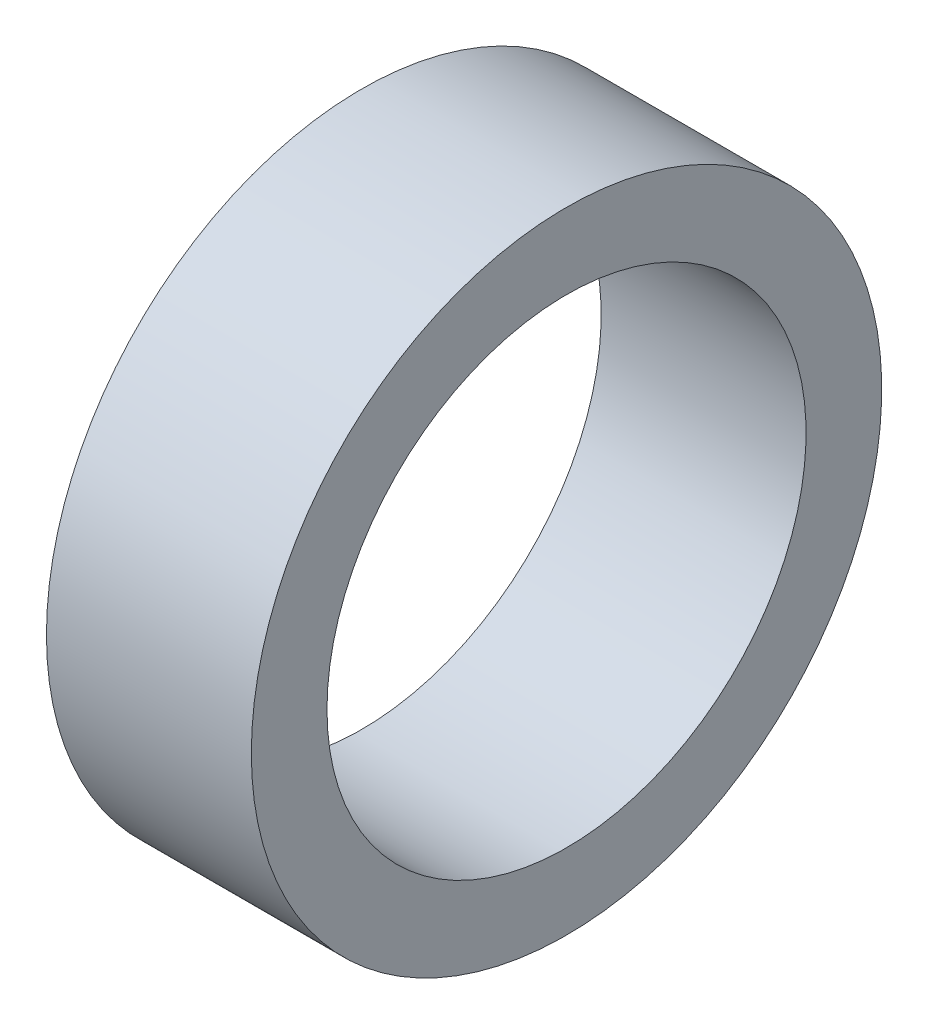
ISO-10303-21;
HEADER;
FILE_DESCRIPTION(('STEP AP214'),'2;1');
FILE_NAME('part.step','',(''),(''),'','','');
FILE_SCHEMA(('AUTOMOTIVE_DESIGN { 1 0 10303 214 1 1 1 1 }'));
ENDSEC;
DATA;
#1=APPLICATION_CONTEXT('core data for automotive mechanical design processes');
#2=APPLICATION_PROTOCOL_DEFINITION('international standard','automotive_design',2000,#1);
#3=PRODUCT_CONTEXT('',#1,'mechanical');
#4=PRODUCT('Part','Part','',(#3));
#5=PRODUCT_RELATED_PRODUCT_CATEGORY('part','',(#4));
#6=PRODUCT_DEFINITION_FORMATION('','',#4);
#7=PRODUCT_DEFINITION_CONTEXT('part definition',#1,'design');
#8=PRODUCT_DEFINITION('design','',#6,#7);
#9=PRODUCT_DEFINITION_SHAPE('','',#8);
#10=(LENGTH_UNIT() NAMED_UNIT(*) SI_UNIT(.MILLI.,.METRE.));
#11=(NAMED_UNIT(*) PLANE_ANGLE_UNIT() SI_UNIT($,.RADIAN.));
#12=(NAMED_UNIT(*) SI_UNIT($,.STERADIAN.) SOLID_ANGLE_UNIT());
#13=UNCERTAINTY_MEASURE_WITH_UNIT(LENGTH_MEASURE(1.E-05),#10,'distance_accuracy_value','');
#14=(GEOMETRIC_REPRESENTATION_CONTEXT(3) GLOBAL_UNCERTAINTY_ASSIGNED_CONTEXT((#13)) GLOBAL_UNIT_ASSIGNED_CONTEXT((#10,
#11,#12)) REPRESENTATION_CONTEXT('',''));
#15=CARTESIAN_POINT('',(0.,0.,0.));
#16=DIRECTION('',(0.,0.,1.));
#17=DIRECTION('',(1.,0.,0.));
#18=AXIS2_PLACEMENT_3D('',#15,#16,#17);
#19=CARTESIAN_POINT('',(6.507,10.007,10.007));
#20=DIRECTION('',(-1.,0.,0.));
#21=DIRECTION('',(0.,0.,1.));
#22=AXIS2_PLACEMENT_3D('',#19,#20,#21);
#23=CYLINDRICAL_SURFACE('',#22,7.6);
#24=CARTESIAN_POINT('',(6.507,10.007,10.007));
#25=DIRECTION('',(-1.,0.,0.));
#26=DIRECTION('',(0.,0.,1.));
#27=AXIS2_PLACEMENT_3D('',#24,#25,#26);
#28=CIRCLE('',#27,7.6);
#29=CARTESIAN_POINT('',(6.507,10.007,17.607));
#30=VERTEX_POINT('',#29);
#31=EDGE_CURVE('E17',#30,#30,#28,.F.);
#32=ORIENTED_EDGE('',*,*,#31,.T.);
#33=EDGE_LOOP('',(#32));
#34=FACE_BOUND('',#33,.T.);
#35=CARTESIAN_POINT('',(0.00699999999994802,10.007,10.007));
#36=DIRECTION('',(-1.,0.,0.));
#37=DIRECTION('',(0.,0.,1.));
#38=AXIS2_PLACEMENT_3D('',#35,#36,#37);
#39=CIRCLE('',#38,7.6);
#40=CARTESIAN_POINT('',(0.00699999999994802,10.007,17.607));
#41=VERTEX_POINT('',#40);
#42=EDGE_CURVE('E26',#41,#41,#39,.F.);
#43=ORIENTED_EDGE('',*,*,#42,.F.);
#44=EDGE_LOOP('',(#43));
#45=FACE_BOUND('',#44,.T.);
#46=ADVANCED_FACE('F14',(#34,#45),#23,.F.);
#47=CARTESIAN_POINT('',(6.507,10.007,10.007));
#48=DIRECTION('',(-1.,0.,0.));
#49=DIRECTION('',(0.,0.,1.));
#50=AXIS2_PLACEMENT_3D('',#47,#48,#49);
#51=PLANE('',#50);
#52=ORIENTED_EDGE('',*,*,#31,.F.);
#53=EDGE_LOOP('',(#52));
#54=FACE_BOUND('',#53,.T.);
#55=CARTESIAN_POINT('',(6.507,10.007,10.007));
#56=DIRECTION('',(-1.,0.,0.));
#57=DIRECTION('',(0.,0.,1.));
#58=AXIS2_PLACEMENT_3D('',#55,#56,#57);
#59=CIRCLE('',#58,10.);
#60=CARTESIAN_POINT('',(6.507,10.007,20.007));
#61=VERTEX_POINT('',#60);
#62=EDGE_CURVE('E21',#61,#61,#59,.T.);
#63=ORIENTED_EDGE('',*,*,#62,.F.);
#64=EDGE_LOOP('',(#63));
#65=FACE_BOUND('',#64,.T.);
#66=ADVANCED_FACE('F36',(#54,#65),#51,.F.);
#67=CARTESIAN_POINT('',(0.006999999999948,10.007,10.007));
#68=DIRECTION('',(-1.,0.,0.));
#69=DIRECTION('',(0.,0.,1.));
#70=AXIS2_PLACEMENT_3D('',#67,#68,#69);
#71=PLANE('',#70);
#72=ORIENTED_EDGE('',*,*,#42,.T.);
#73=EDGE_LOOP('',(#72));
#74=FACE_BOUND('',#73,.T.);
#75=CARTESIAN_POINT('',(0.00699999999994802,10.007,10.007));
#76=DIRECTION('',(-1.,0.,0.));
#77=DIRECTION('',(0.,0.,1.));
#78=AXIS2_PLACEMENT_3D('',#75,#76,#77);
#79=CIRCLE('',#78,10.);
#80=CARTESIAN_POINT('',(0.00699999999994802,10.007,20.007));
#81=VERTEX_POINT('',#80);
#82=EDGE_CURVE('E10',#81,#81,#79,.F.);
#83=ORIENTED_EDGE('',*,*,#82,.F.);
#84=EDGE_LOOP('',(#83));
#85=FACE_BOUND('',#84,.T.);
#86=ADVANCED_FACE('F39',(#74,#85),#71,.T.);
#87=CARTESIAN_POINT('',(6.507,10.007,10.007));
#88=DIRECTION('',(-1.,0.,0.));
#89=DIRECTION('',(0.,0.,1.));
#90=AXIS2_PLACEMENT_3D('',#87,#88,#89);
#91=CYLINDRICAL_SURFACE('',#90,10.);
#92=ORIENTED_EDGE('',*,*,#62,.T.);
#93=EDGE_LOOP('',(#92));
#94=FACE_BOUND('',#93,.T.);
#95=ORIENTED_EDGE('',*,*,#82,.T.);
#96=EDGE_LOOP('',(#95));
#97=FACE_BOUND('',#96,.T.);
#98=ADVANCED_FACE('F42',(#94,#97),#91,.T.);
#99=CLOSED_SHELL('',(#46,#66,#86,#98));
#100=MANIFOLD_SOLID_BREP('B1',#99);
#101=ADVANCED_BREP_SHAPE_REPRESENTATION('',(#18,#100),#14);
#102=SHAPE_DEFINITION_REPRESENTATION(#9,#101);
ENDSEC;
END-ISO-10303-21;
